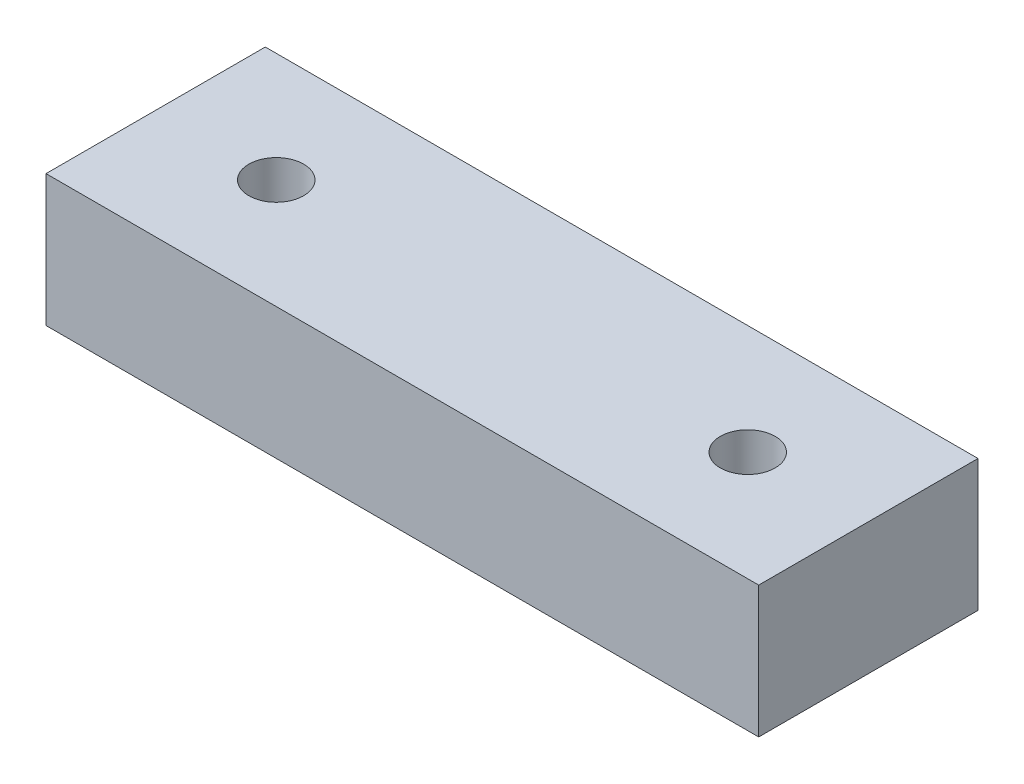
ISO-10303-21;
HEADER;
FILE_DESCRIPTION(('STEP AP214'),'2;1');
FILE_NAME('part.step','',(''),(''),'','','');
FILE_SCHEMA(('AUTOMOTIVE_DESIGN { 1 0 10303 214 1 1 1 1 }'));
ENDSEC;
DATA;
#1=APPLICATION_CONTEXT('core data for automotive mechanical design processes');
#2=APPLICATION_PROTOCOL_DEFINITION('international standard','automotive_design',2000,#1);
#3=PRODUCT_CONTEXT('',#1,'mechanical');
#4=PRODUCT('Part','Part','',(#3));
#5=PRODUCT_RELATED_PRODUCT_CATEGORY('part','',(#4));
#6=PRODUCT_DEFINITION_FORMATION('','',#4);
#7=PRODUCT_DEFINITION_CONTEXT('part definition',#1,'design');
#8=PRODUCT_DEFINITION('design','',#6,#7);
#9=PRODUCT_DEFINITION_SHAPE('','',#8);
#10=(LENGTH_UNIT() NAMED_UNIT(*) SI_UNIT(.MILLI.,.METRE.));
#11=(NAMED_UNIT(*) PLANE_ANGLE_UNIT() SI_UNIT($,.RADIAN.));
#12=(NAMED_UNIT(*) SI_UNIT($,.STERADIAN.) SOLID_ANGLE_UNIT());
#13=UNCERTAINTY_MEASURE_WITH_UNIT(LENGTH_MEASURE(1.E-05),#10,'distance_accuracy_value','');
#14=(GEOMETRIC_REPRESENTATION_CONTEXT(3) GLOBAL_UNCERTAINTY_ASSIGNED_CONTEXT((#13)) GLOBAL_UNIT_ASSIGNED_CONTEXT((#10,
#11,#12)) REPRESENTATION_CONTEXT('',''));
#15=CARTESIAN_POINT('',(0.,0.,0.));
#16=DIRECTION('',(0.,0.,1.));
#17=DIRECTION('',(1.,0.,0.));
#18=AXIS2_PLACEMENT_3D('',#15,#16,#17);
#19=CARTESIAN_POINT('',(32.5,12.,10.));
#20=DIRECTION('',(-1.,0.,0.));
#21=DIRECTION('',(0.,0.,1.));
#22=AXIS2_PLACEMENT_3D('',#19,#20,#21);
#23=PLANE('',#22);
#24=DIRECTION('',(0.,0.,-1.));
#25=VECTOR('',#24,1.);
#26=CARTESIAN_POINT('',(32.5,0.,10.));
#27=LINE('',#26,#25);
#28=CARTESIAN_POINT('',(32.5,0.,10.));
#29=VERTEX_POINT('',#28);
#30=CARTESIAN_POINT('',(32.5,0.,-10.));
#31=VERTEX_POINT('',#30);
#32=EDGE_CURVE('E105',#29,#31,#27,.T.);
#33=ORIENTED_EDGE('',*,*,#32,.T.);
#34=DIRECTION('',(0.,-1.,0.));
#35=VECTOR('',#34,1.);
#36=CARTESIAN_POINT('',(32.5,12.,-10.));
#37=LINE('',#36,#35);
#38=CARTESIAN_POINT('',(32.5,12.,-10.));
#39=VERTEX_POINT('',#38);
#40=EDGE_CURVE('E11',#39,#31,#37,.T.);
#41=ORIENTED_EDGE('',*,*,#40,.F.);
#42=DIRECTION('',(0.,0.,-1.));
#43=VECTOR('',#42,1.);
#44=CARTESIAN_POINT('',(32.5,12.,10.));
#45=LINE('',#44,#43);
#46=CARTESIAN_POINT('',(32.5,12.,10.));
#47=VERTEX_POINT('',#46);
#48=EDGE_CURVE('E92',#47,#39,#45,.T.);
#49=ORIENTED_EDGE('',*,*,#48,.F.);
#50=DIRECTION('',(0.,-1.,0.));
#51=VECTOR('',#50,1.);
#52=CARTESIAN_POINT('',(32.5,12.,10.));
#53=LINE('',#52,#51);
#54=EDGE_CURVE('E101',#47,#29,#53,.T.);
#55=ORIENTED_EDGE('',*,*,#54,.T.);
#56=EDGE_LOOP('',(#33,#41,#49,#55));
#57=FACE_BOUND('',#56,.T.);
#58=ADVANCED_FACE('F39',(#57),#23,.F.);
#59=CARTESIAN_POINT('',(-32.5,12.,-10.));
#60=DIRECTION('',(0.,0.,1.));
#61=DIRECTION('',(1.,0.,0.));
#62=AXIS2_PLACEMENT_3D('',#59,#60,#61);
#63=PLANE('',#62);
#64=DIRECTION('',(-1.,0.,0.));
#65=VECTOR('',#64,1.);
#66=CARTESIAN_POINT('',(-32.5,0.,-10.));
#67=LINE('',#66,#65);
#68=CARTESIAN_POINT('',(-32.5,0.,-10.));
#69=VERTEX_POINT('',#68);
#70=EDGE_CURVE('E96',#31,#69,#67,.T.);
#71=ORIENTED_EDGE('',*,*,#70,.T.);
#72=DIRECTION('',(0.,-1.,0.));
#73=VECTOR('',#72,1.);
#74=CARTESIAN_POINT('',(-32.5,12.,-10.));
#75=LINE('',#74,#73);
#76=CARTESIAN_POINT('',(-32.5,12.,-10.));
#77=VERTEX_POINT('',#76);
#78=EDGE_CURVE('E48',#77,#69,#75,.T.);
#79=ORIENTED_EDGE('',*,*,#78,.F.);
#80=DIRECTION('',(-1.,0.,0.));
#81=VECTOR('',#80,1.);
#82=CARTESIAN_POINT('',(-32.5,12.,-10.));
#83=LINE('',#82,#81);
#84=EDGE_CURVE('E87',#39,#77,#83,.T.);
#85=ORIENTED_EDGE('',*,*,#84,.F.);
#86=ORIENTED_EDGE('',*,*,#40,.T.);
#87=EDGE_LOOP('',(#71,#79,#85,#86));
#88=FACE_BOUND('',#87,.T.);
#89=ADVANCED_FACE('F95',(#88),#63,.F.);
#90=CARTESIAN_POINT('',(-32.5,12.,10.));
#91=DIRECTION('',(1.,0.,0.));
#92=DIRECTION('',(0.,0.,-1.));
#93=AXIS2_PLACEMENT_3D('',#90,#91,#92);
#94=PLANE('',#93);
#95=DIRECTION('',(0.,0.,1.));
#96=VECTOR('',#95,1.);
#97=CARTESIAN_POINT('',(-32.5,0.,10.));
#98=LINE('',#97,#96);
#99=CARTESIAN_POINT('',(-32.5,0.,10.));
#100=VERTEX_POINT('',#99);
#101=EDGE_CURVE('E74',#69,#100,#98,.T.);
#102=ORIENTED_EDGE('',*,*,#101,.T.);
#103=DIRECTION('',(0.,-1.,0.));
#104=VECTOR('',#103,1.);
#105=CARTESIAN_POINT('',(-32.5,12.,10.));
#106=LINE('',#105,#104);
#107=CARTESIAN_POINT('',(-32.5,12.,10.));
#108=VERTEX_POINT('',#107);
#109=EDGE_CURVE('E97',#108,#100,#106,.T.);
#110=ORIENTED_EDGE('',*,*,#109,.F.);
#111=DIRECTION('',(0.,0.,1.));
#112=VECTOR('',#111,1.);
#113=CARTESIAN_POINT('',(-32.5,12.,10.));
#114=LINE('',#113,#112);
#115=EDGE_CURVE('E90',#77,#108,#114,.T.);
#116=ORIENTED_EDGE('',*,*,#115,.F.);
#117=ORIENTED_EDGE('',*,*,#78,.T.);
#118=EDGE_LOOP('',(#102,#110,#116,#117));
#119=FACE_BOUND('',#118,.T.);
#120=ADVANCED_FACE('F99',(#119),#94,.F.);
#121=CARTESIAN_POINT('',(-32.5,12.,10.));
#122=DIRECTION('',(0.,0.,-1.));
#123=DIRECTION('',(-1.,0.,0.));
#124=AXIS2_PLACEMENT_3D('',#121,#122,#123);
#125=PLANE('',#124);
#126=DIRECTION('',(1.,0.,0.));
#127=VECTOR('',#126,1.);
#128=CARTESIAN_POINT('',(-32.5,0.,10.));
#129=LINE('',#128,#127);
#130=EDGE_CURVE('E80',#100,#29,#129,.T.);
#131=ORIENTED_EDGE('',*,*,#130,.T.);
#132=ORIENTED_EDGE('',*,*,#54,.F.);
#133=DIRECTION('',(1.,0.,0.));
#134=VECTOR('',#133,1.);
#135=CARTESIAN_POINT('',(-32.5,12.,10.));
#136=LINE('',#135,#134);
#137=EDGE_CURVE('E57',#108,#47,#136,.T.);
#138=ORIENTED_EDGE('',*,*,#137,.F.);
#139=ORIENTED_EDGE('',*,*,#109,.T.);
#140=EDGE_LOOP('',(#131,#132,#138,#139));
#141=FACE_BOUND('',#140,.T.);
#142=ADVANCED_FACE('F149',(#141),#125,.F.);
#143=CARTESIAN_POINT('',(0.,12.,0.));
#144=DIRECTION('',(0.,-1.,0.));
#145=DIRECTION('',(0.,0.,-1.));
#146=AXIS2_PLACEMENT_3D('',#143,#144,#145);
#147=PLANE('',#146);
#148=CARTESIAN_POINT('',(-21.5,12.,0.));
#149=DIRECTION('',(0.,-1.,0.));
#150=DIRECTION('',(0.,0.,-1.));
#151=AXIS2_PLACEMENT_3D('',#148,#149,#150);
#152=CIRCLE('',#151,2.5);
#153=CARTESIAN_POINT('',(-21.5,12.,-2.5));
#154=VERTEX_POINT('',#153);
#155=EDGE_CURVE('E114',#154,#154,#152,.T.);
#156=ORIENTED_EDGE('',*,*,#155,.T.);
#157=EDGE_LOOP('',(#156));
#158=FACE_BOUND('',#157,.T.);
#159=CARTESIAN_POINT('',(21.5,12.,0.));
#160=DIRECTION('',(0.,-1.,0.));
#161=DIRECTION('',(0.,0.,-1.));
#162=AXIS2_PLACEMENT_3D('',#159,#160,#161);
#163=CIRCLE('',#162,2.5);
#164=CARTESIAN_POINT('',(21.5,12.,-2.5));
#165=VERTEX_POINT('',#164);
#166=EDGE_CURVE('E119',#165,#165,#163,.T.);
#167=ORIENTED_EDGE('',*,*,#166,.T.);
#168=EDGE_LOOP('',(#167));
#169=FACE_BOUND('',#168,.T.);
#170=ORIENTED_EDGE('',*,*,#48,.T.);
#171=ORIENTED_EDGE('',*,*,#84,.T.);
#172=ORIENTED_EDGE('',*,*,#115,.T.);
#173=ORIENTED_EDGE('',*,*,#137,.T.);
#174=EDGE_LOOP('',(#170,#171,#172,#173));
#175=FACE_BOUND('',#174,.T.);
#176=ADVANCED_FACE('F88',(#158,#169,#175),#147,.F.);
#177=CARTESIAN_POINT('',(0.,0.,0.));
#178=DIRECTION('',(0.,-1.,0.));
#179=DIRECTION('',(0.,0.,-1.));
#180=AXIS2_PLACEMENT_3D('',#177,#178,#179);
#181=PLANE('',#180);
#182=CARTESIAN_POINT('',(-21.5,0.,0.));
#183=DIRECTION('',(0.,-1.,0.));
#184=DIRECTION('',(0.,0.,-1.));
#185=AXIS2_PLACEMENT_3D('',#182,#183,#184);
#186=CIRCLE('',#185,2.5);
#187=CARTESIAN_POINT('',(-21.5,0.,-2.5));
#188=VERTEX_POINT('',#187);
#189=EDGE_CURVE('E42',#188,#188,#186,.T.);
#190=ORIENTED_EDGE('',*,*,#189,.F.);
#191=EDGE_LOOP('',(#190));
#192=FACE_BOUND('',#191,.T.);
#193=CARTESIAN_POINT('',(21.5,0.,0.));
#194=DIRECTION('',(0.,-1.,0.));
#195=DIRECTION('',(0.,0.,-1.));
#196=AXIS2_PLACEMENT_3D('',#193,#194,#195);
#197=CIRCLE('',#196,2.5);
#198=CARTESIAN_POINT('',(21.5,0.,-2.5));
#199=VERTEX_POINT('',#198);
#200=EDGE_CURVE('E112',#199,#199,#197,.T.);
#201=ORIENTED_EDGE('',*,*,#200,.F.);
#202=EDGE_LOOP('',(#201));
#203=FACE_BOUND('',#202,.T.);
#204=ORIENTED_EDGE('',*,*,#32,.F.);
#205=ORIENTED_EDGE('',*,*,#130,.F.);
#206=ORIENTED_EDGE('',*,*,#101,.F.);
#207=ORIENTED_EDGE('',*,*,#70,.F.);
#208=EDGE_LOOP('',(#204,#205,#206,#207));
#209=FACE_BOUND('',#208,.T.);
#210=ADVANCED_FACE('F131',(#192,#203,#209),#181,.T.);
#211=CARTESIAN_POINT('',(21.5,12.,0.));
#212=DIRECTION('',(0.,-1.,0.));
#213=DIRECTION('',(0.,0.,-1.));
#214=AXIS2_PLACEMENT_3D('',#211,#212,#213);
#215=CYLINDRICAL_SURFACE('',#214,2.5);
#216=ORIENTED_EDGE('',*,*,#200,.T.);
#217=EDGE_LOOP('',(#216));
#218=FACE_BOUND('',#217,.T.);
#219=ORIENTED_EDGE('',*,*,#166,.F.);
#220=EDGE_LOOP('',(#219));
#221=FACE_BOUND('',#220,.T.);
#222=ADVANCED_FACE('F128',(#218,#221),#215,.F.);
#223=CARTESIAN_POINT('',(-21.5,12.,0.));
#224=DIRECTION('',(0.,-1.,0.));
#225=DIRECTION('',(0.,0.,-1.));
#226=AXIS2_PLACEMENT_3D('',#223,#224,#225);
#227=CYLINDRICAL_SURFACE('',#226,2.5);
#228=ORIENTED_EDGE('',*,*,#189,.T.);
#229=EDGE_LOOP('',(#228));
#230=FACE_BOUND('',#229,.T.);
#231=ORIENTED_EDGE('',*,*,#155,.F.);
#232=EDGE_LOOP('',(#231));
#233=FACE_BOUND('',#232,.T.);
#234=ADVANCED_FACE('F130',(#230,#233),#227,.F.);
#235=CLOSED_SHELL('',(#58,#89,#120,#142,#176,#210,#222,#234));
#236=MANIFOLD_SOLID_BREP('B2',#235);
#237=ADVANCED_BREP_SHAPE_REPRESENTATION('',(#18,#236),#14);
#238=SHAPE_DEFINITION_REPRESENTATION(#9,#237);
ENDSEC;
END-ISO-10303-21;
